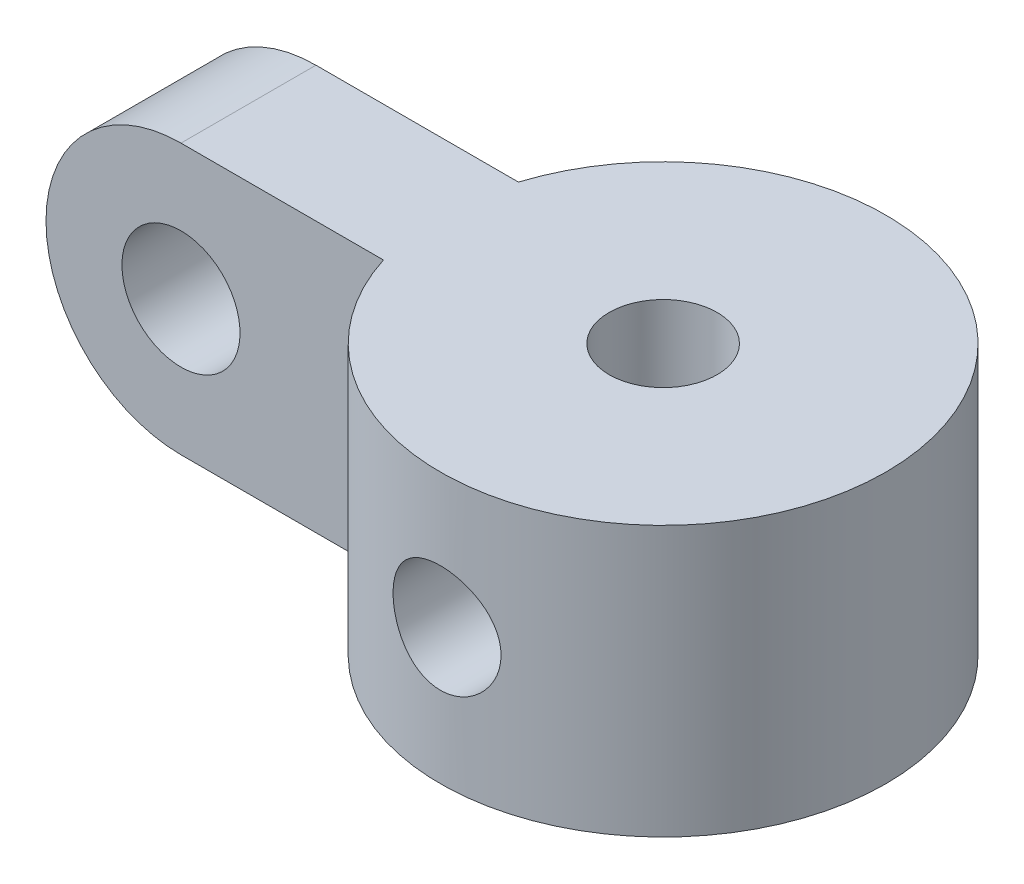
ISO-10303-21;
HEADER;
FILE_DESCRIPTION(('STEP AP214'),'2;1');
FILE_NAME('part.step','',(''),(''),'','','');
FILE_SCHEMA(('AUTOMOTIVE_DESIGN { 1 0 10303 214 1 1 1 1 }'));
ENDSEC;
DATA;
#1=APPLICATION_CONTEXT('core data for automotive mechanical design processes');
#2=APPLICATION_PROTOCOL_DEFINITION('international standard','automotive_design',2000,#1);
#3=PRODUCT_CONTEXT('',#1,'mechanical');
#4=PRODUCT('Part','Part','',(#3));
#5=PRODUCT_RELATED_PRODUCT_CATEGORY('part','',(#4));
#6=PRODUCT_DEFINITION_FORMATION('','',#4);
#7=PRODUCT_DEFINITION_CONTEXT('part definition',#1,'design');
#8=PRODUCT_DEFINITION('design','',#6,#7);
#9=PRODUCT_DEFINITION_SHAPE('','',#8);
#10=(LENGTH_UNIT() NAMED_UNIT(*) SI_UNIT(.MILLI.,.METRE.));
#11=(NAMED_UNIT(*) PLANE_ANGLE_UNIT() SI_UNIT($,.RADIAN.));
#12=(NAMED_UNIT(*) SI_UNIT($,.STERADIAN.) SOLID_ANGLE_UNIT());
#13=UNCERTAINTY_MEASURE_WITH_UNIT(LENGTH_MEASURE(1.E-05),#10,'distance_accuracy_value','');
#14=(GEOMETRIC_REPRESENTATION_CONTEXT(3) GLOBAL_UNCERTAINTY_ASSIGNED_CONTEXT((#13)) GLOBAL_UNIT_ASSIGNED_CONTEXT((#10,
#11,#12)) REPRESENTATION_CONTEXT('',''));
#15=CARTESIAN_POINT('',(0.,0.,0.));
#16=DIRECTION('',(0.,0.,1.));
#17=DIRECTION('',(1.,0.,0.));
#18=AXIS2_PLACEMENT_3D('',#15,#16,#17);
#19=CARTESIAN_POINT('',(0.,8.,-2.));
#20=DIRECTION('',(0.,0.,-1.));
#21=DIRECTION('',(-1.,0.,0.));
#22=AXIS2_PLACEMENT_3D('',#19,#20,#21);
#23=PLANE('',#22);
#24=CARTESIAN_POINT('',(-12.2896740774066,4.,-2.));
#25=DIRECTION('',(0.,0.,-1.));
#26=DIRECTION('',(-1.,0.,0.));
#27=AXIS2_PLACEMENT_3D('',#24,#25,#26);
#28=CIRCLE('',#27,1.75);
#29=CARTESIAN_POINT('',(-14.0396740774066,4.,-2.));
#30=VERTEX_POINT('',#29);
#31=EDGE_CURVE('E221',#30,#30,#28,.T.);
#32=ORIENTED_EDGE('',*,*,#31,.F.);
#33=EDGE_LOOP('',(#32));
#34=FACE_BOUND('',#33,.T.);
#35=DIRECTION('',(1.,0.,0.));
#36=VECTOR('',#35,1.);
#37=CARTESIAN_POINT('',(0.,0.,-2.));
#38=LINE('',#37,#36);
#39=CARTESIAN_POINT('',(-12.2896740774066,0.,-2.));
#40=VERTEX_POINT('',#39);
#41=CARTESIAN_POINT('',(-6.28967407740656,0.,-2.));
#42=VERTEX_POINT('',#41);
#43=EDGE_CURVE('E156',#40,#42,#38,.T.);
#44=ORIENTED_EDGE('',*,*,#43,.F.);
#45=CARTESIAN_POINT('',(-12.2896740774066,4.,-2.));
#46=DIRECTION('',(0.,0.,-1.));
#47=DIRECTION('',(-1.,0.,0.));
#48=AXIS2_PLACEMENT_3D('',#45,#46,#47);
#49=CIRCLE('',#48,4.);
#50=CARTESIAN_POINT('',(-12.2896740774066,8.,-2.));
#51=VERTEX_POINT('',#50);
#52=EDGE_CURVE('E141',#40,#51,#49,.T.);
#53=ORIENTED_EDGE('',*,*,#52,.T.);
#54=DIRECTION('',(1.,0.,0.));
#55=VECTOR('',#54,1.);
#56=CARTESIAN_POINT('',(0.,8.,-2.));
#57=LINE('',#56,#55);
#58=CARTESIAN_POINT('',(-6.28967407740656,8.,-2.));
#59=VERTEX_POINT('',#58);
#60=EDGE_CURVE('E209',#51,#59,#57,.T.);
#61=ORIENTED_EDGE('',*,*,#60,.T.);
#62=DIRECTION('',(0.,-1.,0.));
#63=VECTOR('',#62,1.);
#64=CARTESIAN_POINT('',(-6.28967407740656,8.,-2.));
#65=LINE('',#64,#63);
#66=EDGE_CURVE('E162',#59,#42,#65,.T.);
#67=ORIENTED_EDGE('',*,*,#66,.T.);
#68=EDGE_LOOP('',(#44,#53,#61,#67));
#69=FACE_BOUND('',#68,.T.);
#70=ADVANCED_FACE('F93',(#34,#69),#23,.T.);
#71=CARTESIAN_POINT('',(0.,8.,2.));
#72=DIRECTION('',(0.,0.,-1.));
#73=DIRECTION('',(-1.,0.,0.));
#74=AXIS2_PLACEMENT_3D('',#71,#72,#73);
#75=PLANE('',#74);
#76=CARTESIAN_POINT('',(-12.2896740774066,4.,2.));
#77=DIRECTION('',(0.,0.,-1.));
#78=DIRECTION('',(-1.,0.,0.));
#79=AXIS2_PLACEMENT_3D('',#76,#77,#78);
#80=CIRCLE('',#79,1.75);
#81=CARTESIAN_POINT('',(-14.0396740774066,4.,2.));
#82=VERTEX_POINT('',#81);
#83=EDGE_CURVE('E97',#82,#82,#80,.T.);
#84=ORIENTED_EDGE('',*,*,#83,.T.);
#85=EDGE_LOOP('',(#84));
#86=FACE_BOUND('',#85,.T.);
#87=CARTESIAN_POINT('',(-12.2896740774066,4.,2.));
#88=DIRECTION('',(0.,0.,-1.));
#89=DIRECTION('',(-1.,0.,0.));
#90=AXIS2_PLACEMENT_3D('',#87,#88,#89);
#91=CIRCLE('',#90,4.);
#92=CARTESIAN_POINT('',(-12.2896740774066,0.,2.));
#93=VERTEX_POINT('',#92);
#94=CARTESIAN_POINT('',(-12.2896740774066,8.,2.));
#95=VERTEX_POINT('',#94);
#96=EDGE_CURVE('E117',#93,#95,#91,.T.);
#97=ORIENTED_EDGE('',*,*,#96,.F.);
#98=DIRECTION('',(1.,0.,0.));
#99=VECTOR('',#98,1.);
#100=CARTESIAN_POINT('',(0.,0.,2.));
#101=LINE('',#100,#99);
#102=CARTESIAN_POINT('',(-6.28967407740656,0.,2.));
#103=VERTEX_POINT('',#102);
#104=EDGE_CURVE('E158',#93,#103,#101,.T.);
#105=ORIENTED_EDGE('',*,*,#104,.T.);
#106=DIRECTION('',(0.,-1.,0.));
#107=VECTOR('',#106,1.);
#108=CARTESIAN_POINT('',(-6.28967407740656,8.,2.));
#109=LINE('',#108,#107);
#110=CARTESIAN_POINT('',(-6.28967407740656,8.,2.));
#111=VERTEX_POINT('',#110);
#112=EDGE_CURVE('E174',#111,#103,#109,.T.);
#113=ORIENTED_EDGE('',*,*,#112,.F.);
#114=DIRECTION('',(1.,0.,0.));
#115=VECTOR('',#114,1.);
#116=CARTESIAN_POINT('',(0.,8.,2.));
#117=LINE('',#116,#115);
#118=EDGE_CURVE('E178',#95,#111,#117,.T.);
#119=ORIENTED_EDGE('',*,*,#118,.F.);
#120=EDGE_LOOP('',(#97,#105,#113,#119));
#121=FACE_BOUND('',#120,.T.);
#122=ADVANCED_FACE('F253',(#86,#121),#75,.F.);
#123=CARTESIAN_POINT('',(0.,8.,0.));
#124=DIRECTION('',(0.,-1.,0.));
#125=DIRECTION('',(0.,0.,-1.));
#126=AXIS2_PLACEMENT_3D('',#123,#124,#125);
#127=CYLINDRICAL_SURFACE('',#126,1.6);
#128=CARTESIAN_POINT('',(0.,4.,0.));
#129=DIRECTION('',(0.,-0.707106781186547,0.707106781186547));
#130=DIRECTION('',(0.,-0.707106781186547,-0.707106781186547));
#131=AXIS2_PLACEMENT_3D('',#128,#129,#130);
#132=ELLIPSE('',#131,2.26274169979695,1.6);
#133=CARTESIAN_POINT('',(-1.6,4.,0.));
#134=VERTEX_POINT('',#133);
#135=CARTESIAN_POINT('',(1.6,4.,0.));
#136=VERTEX_POINT('',#135);
#137=EDGE_CURVE('E12',#134,#136,#132,.F.);
#138=ORIENTED_EDGE('',*,*,#137,.F.);
#139=CARTESIAN_POINT('',(0.,4.,0.));
#140=DIRECTION('',(0.,-0.707106781186547,-0.707106781186547));
#141=DIRECTION('',(0.,-0.707106781186547,0.707106781186547));
#142=AXIS2_PLACEMENT_3D('',#139,#140,#141);
#143=ELLIPSE('',#142,2.26274169979695,1.6);
#144=EDGE_CURVE('E109',#136,#134,#143,.F.);
#145=ORIENTED_EDGE('',*,*,#144,.F.);
#146=EDGE_LOOP('',(#138,#145));
#147=FACE_BOUND('',#146,.T.);
#148=CARTESIAN_POINT('',(0.,8.,0.));
#149=DIRECTION('',(0.,1.,0.));
#150=DIRECTION('',(0.,0.,1.));
#151=AXIS2_PLACEMENT_3D('',#148,#149,#150);
#152=CIRCLE('',#151,1.6);
#153=CARTESIAN_POINT('',(0.,8.,1.6));
#154=VERTEX_POINT('',#153);
#155=EDGE_CURVE('E169',#154,#154,#152,.T.);
#156=ORIENTED_EDGE('',*,*,#155,.T.);
#157=EDGE_LOOP('',(#156));
#158=FACE_BOUND('',#157,.T.);
#159=ADVANCED_FACE('F201',(#147,#158),#127,.F.);
#160=CARTESIAN_POINT('',(0.,0.,0.));
#161=DIRECTION('',(0.,1.,0.));
#162=DIRECTION('',(0.,0.,1.));
#163=AXIS2_PLACEMENT_3D('',#160,#161,#162);
#164=PLANE('',#163);
#165=CARTESIAN_POINT('',(0.,0.,0.));
#166=DIRECTION('',(0.,1.,0.));
#167=DIRECTION('',(0.,0.,1.));
#168=AXIS2_PLACEMENT_3D('',#165,#166,#167);
#169=CIRCLE('',#168,1.6);
#170=CARTESIAN_POINT('',(0.,0.,1.6));
#171=VERTEX_POINT('',#170);
#172=EDGE_CURVE('E151',#171,#171,#169,.T.);
#173=ORIENTED_EDGE('',*,*,#172,.T.);
#174=EDGE_LOOP('',(#173));
#175=FACE_BOUND('',#174,.T.);
#176=DIRECTION('',(0.,0.,1.));
#177=VECTOR('',#176,1.);
#178=CARTESIAN_POINT('',(-12.2896740774066,0.,-6.6));
#179=LINE('',#178,#177);
#180=EDGE_CURVE('E144',#40,#93,#179,.T.);
#181=ORIENTED_EDGE('',*,*,#180,.F.);
#182=ORIENTED_EDGE('',*,*,#43,.T.);
#183=CARTESIAN_POINT('',(0.,0.,0.));
#184=DIRECTION('',(0.,1.,0.));
#185=DIRECTION('',(0.,0.,1.));
#186=AXIS2_PLACEMENT_3D('',#183,#184,#185);
#187=CIRCLE('',#186,6.6);
#188=EDGE_CURVE('E165',#103,#42,#187,.T.);
#189=ORIENTED_EDGE('',*,*,#188,.F.);
#190=ORIENTED_EDGE('',*,*,#104,.F.);
#191=EDGE_LOOP('',(#181,#182,#189,#190));
#192=FACE_BOUND('',#191,.T.);
#193=ADVANCED_FACE('F154',(#175,#192),#164,.F.);
#194=CARTESIAN_POINT('',(0.,8.,0.));
#195=DIRECTION('',(0.,1.,0.));
#196=DIRECTION('',(0.,0.,1.));
#197=AXIS2_PLACEMENT_3D('',#194,#195,#196);
#198=PLANE('',#197);
#199=ORIENTED_EDGE('',*,*,#155,.F.);
#200=EDGE_LOOP('',(#199));
#201=FACE_BOUND('',#200,.T.);
#202=ORIENTED_EDGE('',*,*,#60,.F.);
#203=DIRECTION('',(0.,0.,1.));
#204=VECTOR('',#203,1.);
#205=CARTESIAN_POINT('',(-12.2896740774066,8.,-6.6));
#206=LINE('',#205,#204);
#207=EDGE_CURVE('E146',#51,#95,#206,.T.);
#208=ORIENTED_EDGE('',*,*,#207,.T.);
#209=ORIENTED_EDGE('',*,*,#118,.T.);
#210=CARTESIAN_POINT('',(0.,8.,0.));
#211=DIRECTION('',(0.,1.,0.));
#212=DIRECTION('',(0.,0.,1.));
#213=AXIS2_PLACEMENT_3D('',#210,#211,#212);
#214=CIRCLE('',#213,6.6);
#215=EDGE_CURVE('E212',#111,#59,#214,.T.);
#216=ORIENTED_EDGE('',*,*,#215,.T.);
#217=EDGE_LOOP('',(#202,#208,#209,#216));
#218=FACE_BOUND('',#217,.T.);
#219=ADVANCED_FACE('F247',(#201,#218),#198,.T.);
#220=CARTESIAN_POINT('',(0.,8.,0.));
#221=DIRECTION('',(0.,-1.,0.));
#222=DIRECTION('',(0.,0.,-1.));
#223=AXIS2_PLACEMENT_3D('',#220,#221,#222);
#224=CYLINDRICAL_SURFACE('',#223,6.6);
#225=CARTESIAN_POINT('',(1.6,4.,-6.40312423743285));
#226=CARTESIAN_POINT('',(1.59999733947836,4.08844402406098,-6.40312597037609));
#227=CARTESIAN_POINT('',(1.59264157848281,4.17691809600071,-6.40497670400888));
#228=CARTESIAN_POINT('',(1.56345601743318,4.35133182154082,-6.4121621325328));
#229=CARTESIAN_POINT('',(1.54161728105349,4.43726987614424,-6.41749897840401));
#230=CARTESIAN_POINT('',(1.48420900234039,4.60406355514517,-6.43101748536075));
#231=CARTESIAN_POINT('',(1.44865650524925,4.68492534448298,-6.43919561368331));
#232=CARTESIAN_POINT('',(1.3648810998873,4.83954379086885,-6.45747086045777));
#233=CARTESIAN_POINT('',(1.31665785249965,4.91330025767959,-6.46756803026843));
#234=CARTESIAN_POINT('',(1.20784389900135,5.05314159602282,-6.48877758318028));
#235=CARTESIAN_POINT('',(1.14703929913897,5.11905772455782,-6.49990538881894));
#236=CARTESIAN_POINT('',(1.01524965153105,5.23986289597431,-6.5217882988137));
#237=CARTESIAN_POINT('',(0.944263695721746,5.29475095422509,-6.53254336981968));
#238=CARTESIAN_POINT('',(0.792976530006599,5.39262652396975,-6.55263898037571));
#239=CARTESIAN_POINT('',(0.71256570600993,5.43544913714583,-6.56195919706409));
#240=CARTESIAN_POINT('',(0.545423893058168,5.50690743021361,-6.57795945463852));
#241=CARTESIAN_POINT('',(0.458693781262912,5.53554507478769,-6.58463986112431));
#242=CARTESIAN_POINT('',(0.28313343703087,5.57728248350463,-6.59449878121048));
#243=CARTESIAN_POINT('',(0.194374956348101,5.59066857236418,-6.59774174354862));
#244=CARTESIAN_POINT('',(0.0158168750524344,5.60242074593819,-6.60058464260182));
#245=CARTESIAN_POINT('',(-0.0739825787233714,5.60078892390197,-6.60018508702391));
#246=CARTESIAN_POINT('',(-0.25009076322241,5.5827593886002,-6.59583627033507));
#247=CARTESIAN_POINT('',(-0.336433231377963,5.56667061845232,-6.59196128200833));
#248=CARTESIAN_POINT('',(-0.505154519829912,5.52067938716169,-6.58118299179282));
#249=CARTESIAN_POINT('',(-0.587533136198652,5.49077621614884,-6.57427953428333));
#250=CARTESIAN_POINT('',(-0.74681326529544,5.41774922909505,-6.55810487467464));
#251=CARTESIAN_POINT('',(-0.823661440791099,5.37451366657421,-6.54881377443151));
#252=CARTESIAN_POINT('',(-0.969121094903154,5.27613357148008,-6.52887450690487));
#253=CARTESIAN_POINT('',(-1.03773121476807,5.22098707855287,-6.51822611635086));
#254=CARTESIAN_POINT('',(-1.16660863727456,5.09868762962085,-6.49641521034034));
#255=CARTESIAN_POINT('',(-1.22661882104947,5.03126455163238,-6.48524650824044));
#256=CARTESIAN_POINT('',(-1.33453585965573,4.88719490884861,-6.46390352969242));
#257=CARTESIAN_POINT('',(-1.38244221584308,4.81054796424765,-6.45372929422414));
#258=CARTESIAN_POINT('',(-1.46494322915083,4.64972470273884,-6.43550637883586));
#259=CARTESIAN_POINT('',(-1.4994794029305,4.56551724795948,-6.42746708453676));
#260=CARTESIAN_POINT('',(-1.55382718977604,4.39225039215391,-6.41454673226991));
#261=CARTESIAN_POINT('',(-1.57364174189015,4.30319196339657,-6.40966504393782));
#262=CARTESIAN_POINT('',(-1.59756435294379,4.12512682937485,-6.40374402358904));
#263=CARTESIAN_POINT('',(-1.60205110778769,4.03617402039503,-6.40261207062851));
#264=CARTESIAN_POINT('',(-1.59622462099622,3.85879092404816,-6.40406713975094));
#265=CARTESIAN_POINT('',(-1.58591265192973,3.77036059240892,-6.4066538420601));
#266=CARTESIAN_POINT('',(-1.55111264233716,3.59791634012609,-6.41516633208495));
#267=CARTESIAN_POINT('',(-1.52684202876438,3.51385577255964,-6.42104086992378));
#268=CARTESIAN_POINT('',(-1.46505330245464,3.35099563472862,-6.43541907577093));
#269=CARTESIAN_POINT('',(-1.427533693674,3.27219665978537,-6.44392304067414));
#270=CARTESIAN_POINT('',(-1.33950890361332,3.12048324751841,-6.46279907110407));
#271=CARTESIAN_POINT('',(-1.28877556385843,3.04770522515797,-6.47320288866304));
#272=CARTESIAN_POINT('',(-1.176054449739,2.91155642689974,-6.49462703788132));
#273=CARTESIAN_POINT('',(-1.11406494115952,2.84818710331931,-6.50564746435902));
#274=CARTESIAN_POINT('',(-0.978859243852804,2.73113684816081,-6.52737484171816));
#275=CARTESIAN_POINT('',(-0.905414542587484,2.67771694544761,-6.5380684476914));
#276=CARTESIAN_POINT('',(-0.750376177663217,2.58397023624514,-6.55766967940658));
#277=CARTESIAN_POINT('',(-0.668782931491631,2.54364275942034,-6.56657739657757));
#278=CARTESIAN_POINT('',(-0.500317828978865,2.47756489223356,-6.58154809251216));
#279=CARTESIAN_POINT('',(-0.413487967421985,2.45171216041208,-6.58763099011155));
#280=CARTESIAN_POINT('',(-0.236550277056997,2.41500676666825,-6.59635362322054));
#281=CARTESIAN_POINT('',(-0.146443043735652,2.40415139361489,-6.5989939810466));
#282=CARTESIAN_POINT('',(0.0320330834287471,2.39789370197624,-6.60051038370048));
#283=CARTESIAN_POINT('',(0.120387845166776,2.4021050810357,-6.59948053308083));
#284=CARTESIAN_POINT('',(0.295090603727327,2.42498180031035,-6.59397912156365));
#285=CARTESIAN_POINT('',(0.381438653778092,2.44364675669111,-6.58950765206303));
#286=CARTESIAN_POINT('',(0.549299070646439,2.49469887896567,-6.57763810488231));
#287=CARTESIAN_POINT('',(0.630832598167391,2.52701996018495,-6.57025413266408));
#288=CARTESIAN_POINT('',(0.787364816025318,2.60440616156891,-6.55333973860274));
#289=CARTESIAN_POINT('',(0.862362725594601,2.64947280163974,-6.54380906079289));
#290=CARTESIAN_POINT('',(1.00554031833552,2.75226967813651,-6.52336129617945));
#291=CARTESIAN_POINT('',(1.07352623332947,2.81026451788978,-6.51241761643753));
#292=CARTESIAN_POINT('',(1.19893242972994,2.93675265363601,-6.49050250288316));
#293=CARTESIAN_POINT('',(1.25635006733463,3.00524856878544,-6.47953106282008));
#294=CARTESIAN_POINT('',(1.35995880768537,3.15221778456658,-6.45858815699281));
#295=CARTESIAN_POINT('',(1.40593901379458,3.23084290180638,-6.448637221504));
#296=CARTESIAN_POINT('',(1.48395977964431,3.39493550764195,-6.43113315660768));
#297=CARTESIAN_POINT('',(1.51601091235572,3.48039774791219,-6.42357820968792));
#298=CARTESIAN_POINT('',(1.56024691692113,3.63814570603387,-6.41295817096726));
#299=CARTESIAN_POINT('',(1.57512286070378,3.70964864102359,-6.40929733413103));
#300=CARTESIAN_POINT('',(1.59500013121856,3.85409430607224,-6.40437974225737));
#301=CARTESIAN_POINT('',(1.60000219483265,3.92703692827776,-6.40312280781832));
#302=CARTESIAN_POINT('',(1.6,4.,-6.40312423743285));
#303=B_SPLINE_CURVE_WITH_KNOTS('',3,(#225,#226,#227,#228,#229,#230,#231,#232,#233,#234,#235,
#236,#237,#238,#239,#240,#241,#242,#243,#244,#245,#246,#247,#248,#249,#250,#251,#252,#253,#254,
#255,#256,#257,#258,#259,#260,#261,#262,#263,#264,#265,#266,#267,#268,#269,#270,#271,#272,#273,
#274,#275,#276,#277,#278,#279,#280,#281,#282,#283,#284,#285,#286,#287,#288,#289,#290,#291,#292,
#293,#294,#295,#296,#297,#298,#299,#300,#301,#302),.UNSPECIFIED.,.T.,.F.,(4,2,2,2,2,2,2,2,2,2,2,
2,2,2,2,2,2,2,2,2,2,2,2,2,2,2,2,2,2,2,2,2,2,2,2,2,2,2,4),(0.,0.265064273258436,
0.530292249566571,0.795191622869191,1.0600980865956,1.32994540119492,1.59981679815771,
1.87321504847942,2.14657542130955,2.41471463941518,2.68281648389817,2.94532180998148,
3.20784062672676,3.47262248908861,3.73744796368044,4.00902119378664,4.28060561013037,
4.55336490852977,4.82606973818098,5.09198626575298,5.35787992805489,5.619739930883,
5.88162951175322,6.1483813618781,6.41517434484027,6.68820231251325,6.96121629887957,
7.23227478485269,7.50328426411234,7.76739558504667,8.03149989238554,8.29434052625653,
8.55721251706291,8.82606066778539,9.09497598347789,9.36853321512672,9.64188243681685,
9.86056704862862,10.0792353395176),.UNSPECIFIED.);
#304=CARTESIAN_POINT('',(1.6,4.,-6.40312423743285));
#305=VERTEX_POINT('',#304);
#306=EDGE_CURVE('E225',#305,#305,#303,.T.);
#307=ORIENTED_EDGE('',*,*,#306,.T.);
#308=EDGE_LOOP('',(#307));
#309=FACE_BOUND('',#308,.T.);
#310=CARTESIAN_POINT('',(1.6,4.,6.40312423743285));
#311=CARTESIAN_POINT('',(1.59999733947836,3.91155597593902,6.40312597037609));
#312=CARTESIAN_POINT('',(1.59264157848281,3.82308190399929,6.40497670400888));
#313=CARTESIAN_POINT('',(1.56345601743318,3.64866817845918,6.4121621325328));
#314=CARTESIAN_POINT('',(1.54161728105349,3.56273012385576,6.41749897840401));
#315=CARTESIAN_POINT('',(1.48420900234039,3.39593644485483,6.43101748536075));
#316=CARTESIAN_POINT('',(1.44865650524925,3.31507465551702,6.43919561368331));
#317=CARTESIAN_POINT('',(1.3648810998873,3.16045620913115,6.45747086045777));
#318=CARTESIAN_POINT('',(1.31665785249964,3.08669974232041,6.46756803026843));
#319=CARTESIAN_POINT('',(1.20784389900135,2.94685840397718,6.48877758318028));
#320=CARTESIAN_POINT('',(1.14703929913897,2.88094227544218,6.49990538881894));
#321=CARTESIAN_POINT('',(1.01524965153105,2.76013710402569,6.5217882988137));
#322=CARTESIAN_POINT('',(0.944263695721746,2.70524904577491,6.53254336981968));
#323=CARTESIAN_POINT('',(0.792976530006598,2.60737347603025,6.55263898037571));
#324=CARTESIAN_POINT('',(0.712565706009929,2.56455086285417,6.56195919706409));
#325=CARTESIAN_POINT('',(0.545423893058167,2.49309256978639,6.57795945463852));
#326=CARTESIAN_POINT('',(0.458693781262911,2.46445492521231,6.58463986112431));
#327=CARTESIAN_POINT('',(0.283133437030869,2.42271751649537,6.59449878121048));
#328=CARTESIAN_POINT('',(0.1943749563481,2.40933142763582,6.59774174354862));
#329=CARTESIAN_POINT('',(0.015816875052433,2.39757925406181,6.60058464260182));
#330=CARTESIAN_POINT('',(-0.0739825787233729,2.39921107609803,6.60018508702391));
#331=CARTESIAN_POINT('',(-0.250090763222411,2.4172406113998,6.59583627033507));
#332=CARTESIAN_POINT('',(-0.336433231377964,2.43332938154768,6.59196128200833));
#333=CARTESIAN_POINT('',(-0.505154519829913,2.47932061283831,6.58118299179282));
#334=CARTESIAN_POINT('',(-0.587533136198653,2.50922378385116,6.57427953428333));
#335=CARTESIAN_POINT('',(-0.746813265295442,2.58225077090495,6.55810487467464));
#336=CARTESIAN_POINT('',(-0.823661440791101,2.62548633342579,6.54881377443151));
#337=CARTESIAN_POINT('',(-0.969121094903155,2.72386642851992,6.52887450690487));
#338=CARTESIAN_POINT('',(-1.03773121476807,2.77901292144713,6.51822611635086));
#339=CARTESIAN_POINT('',(-1.16660863727457,2.90131237037916,6.49641521034034));
#340=CARTESIAN_POINT('',(-1.22661882104947,2.96873544836762,6.48524650824044));
#341=CARTESIAN_POINT('',(-1.33453585965573,3.11280509115139,6.46390352969242));
#342=CARTESIAN_POINT('',(-1.38244221584308,3.18945203575236,6.45372929422414));
#343=CARTESIAN_POINT('',(-1.46494322915083,3.35027529726117,6.43550637883586));
#344=CARTESIAN_POINT('',(-1.4994794029305,3.43448275204052,6.42746708453676));
#345=CARTESIAN_POINT('',(-1.55382718977604,3.60774960784609,6.41454673226991));
#346=CARTESIAN_POINT('',(-1.57364174189015,3.69680803660343,6.40966504393782));
#347=CARTESIAN_POINT('',(-1.59756435294379,3.87487317062515,6.40374402358904));
#348=CARTESIAN_POINT('',(-1.60205110778769,3.96382597960497,6.40261207062851));
#349=CARTESIAN_POINT('',(-1.59622462099622,4.14120907595185,6.40406713975094));
#350=CARTESIAN_POINT('',(-1.58591265192973,4.22963940759109,6.4066538420601));
#351=CARTESIAN_POINT('',(-1.55111264233716,4.40208365987391,6.41516633208495));
#352=CARTESIAN_POINT('',(-1.52684202876438,4.48614422744036,6.42104086992378));
#353=CARTESIAN_POINT('',(-1.46505330245464,4.64900436527138,6.43541907577093));
#354=CARTESIAN_POINT('',(-1.427533693674,4.72780334021463,6.44392304067414));
#355=CARTESIAN_POINT('',(-1.33950890361332,4.87951675248159,6.46279907110407));
#356=CARTESIAN_POINT('',(-1.28877556385843,4.95229477484203,6.47320288866304));
#357=CARTESIAN_POINT('',(-1.176054449739,5.08844357310027,6.49462703788132));
#358=CARTESIAN_POINT('',(-1.11406494115952,5.15181289668069,6.50564746435903));
#359=CARTESIAN_POINT('',(-0.978859243852802,5.2688631518392,6.52737484171817));
#360=CARTESIAN_POINT('',(-0.905414542587482,5.3222830545524,6.5380684476914));
#361=CARTESIAN_POINT('',(-0.750376177663215,5.41602976375486,6.55766967940658));
#362=CARTESIAN_POINT('',(-0.668782931491629,5.45635724057966,6.56657739657757));
#363=CARTESIAN_POINT('',(-0.500317828978863,5.52243510776645,6.58154809251216));
#364=CARTESIAN_POINT('',(-0.413487967421983,5.54828783958792,6.58763099011155));
#365=CARTESIAN_POINT('',(-0.236550277056996,5.58499323333175,6.59635362322054));
#366=CARTESIAN_POINT('',(-0.14644304373565,5.59584860638511,6.5989939810466));
#367=CARTESIAN_POINT('',(0.0320330834287485,5.60210629802376,6.60051038370048));
#368=CARTESIAN_POINT('',(0.120387845166777,5.5978949189643,6.59948053308083));
#369=CARTESIAN_POINT('',(0.295090603727328,5.57501819968965,6.59397912156365));
#370=CARTESIAN_POINT('',(0.381438653778093,5.55635324330889,6.58950765206303));
#371=CARTESIAN_POINT('',(0.549299070646441,5.50530112103433,6.57763810488231));
#372=CARTESIAN_POINT('',(0.630832598167394,5.47298003981505,6.57025413266408));
#373=CARTESIAN_POINT('',(0.787364816025321,5.39559383843109,6.55333973860274));
#374=CARTESIAN_POINT('',(0.862362725594603,5.35052719836026,6.54380906079289));
#375=CARTESIAN_POINT('',(1.00554031833552,5.24773032186349,6.52336129617945));
#376=CARTESIAN_POINT('',(1.07352623332948,5.18973548211022,6.51241761643753));
#377=CARTESIAN_POINT('',(1.19893242972994,5.06324734636399,6.49050250288316));
#378=CARTESIAN_POINT('',(1.25635006733463,4.99475143121456,6.47953106282008));
#379=CARTESIAN_POINT('',(1.35995880768537,4.84778221543341,6.45858815699281));
#380=CARTESIAN_POINT('',(1.40593901379458,4.76915709819362,6.448637221504));
#381=CARTESIAN_POINT('',(1.48395977964431,4.60506449235805,6.43113315660768));
#382=CARTESIAN_POINT('',(1.51601091235572,4.51960225208781,6.42357820968792));
#383=CARTESIAN_POINT('',(1.56024691692113,4.36185429396613,6.41295817096726));
#384=CARTESIAN_POINT('',(1.57512286070378,4.29035135897641,6.40929733413103));
#385=CARTESIAN_POINT('',(1.59500013121856,4.14590569392776,6.40437974225737));
#386=CARTESIAN_POINT('',(1.60000219483265,4.07296307172224,6.40312280781832));
#387=CARTESIAN_POINT('',(1.6,4.,6.40312423743285));
#388=B_SPLINE_CURVE_WITH_KNOTS('',3,(#310,#311,#312,#313,#314,#315,#316,#317,#318,#319,#320,
#321,#322,#323,#324,#325,#326,#327,#328,#329,#330,#331,#332,#333,#334,#335,#336,#337,#338,#339,
#340,#341,#342,#343,#344,#345,#346,#347,#348,#349,#350,#351,#352,#353,#354,#355,#356,#357,#358,
#359,#360,#361,#362,#363,#364,#365,#366,#367,#368,#369,#370,#371,#372,#373,#374,#375,#376,#377,
#378,#379,#380,#381,#382,#383,#384,#385,#386,#387),.UNSPECIFIED.,.T.,.F.,(4,2,2,2,2,2,2,2,2,2,2,
2,2,2,2,2,2,2,2,2,2,2,2,2,2,2,2,2,2,2,2,2,2,2,2,2,2,2,4),(0.,0.265064273258436,
0.530292249566571,0.795191622869193,1.0600980865956,1.32994540119492,1.59981679815771,
1.87321504847942,2.14657542130956,2.41471463941518,2.68281648389817,2.94532180998148,
3.20784062672676,3.47262248908861,3.73744796368044,4.00902119378665,4.28060561013037,
4.55336490852977,4.82606973818099,5.09198626575298,5.3578799280549,5.619739930883,
5.88162951175322,6.1483813618781,6.41517434484028,6.68820231251325,6.96121629887958,
7.23227478485269,7.50328426411234,7.76739558504667,8.03149989238554,8.29434052625654,
8.55721251706292,8.82606066778539,9.09497598347789,9.36853321512673,9.64188243681686,
9.86056704862863,10.0792353395176),.UNSPECIFIED.);
#389=CARTESIAN_POINT('',(1.6,4.,6.40312423743285));
#390=VERTEX_POINT('',#389);
#391=EDGE_CURVE('E233',#390,#390,#388,.T.);
#392=ORIENTED_EDGE('',*,*,#391,.T.);
#393=EDGE_LOOP('',(#392));
#394=FACE_BOUND('',#393,.T.);
#395=ORIENTED_EDGE('',*,*,#188,.T.);
#396=ORIENTED_EDGE('',*,*,#66,.F.);
#397=ORIENTED_EDGE('',*,*,#215,.F.);
#398=ORIENTED_EDGE('',*,*,#112,.T.);
#399=EDGE_LOOP('',(#395,#396,#397,#398));
#400=FACE_BOUND('',#399,.T.);
#401=ADVANCED_FACE('F200',(#309,#394,#400),#224,.T.);
#402=CARTESIAN_POINT('',(0.,4.,0.));
#403=DIRECTION('',(0.,-0.707106781186547,0.707106781186547));
#404=DIRECTION('',(0.,-0.707106781186547,-0.707106781186547));
#405=AXIS2_PLACEMENT_3D('',#402,#403,#404);
#406=ELLIPSE('',#405,2.26274169979695,1.6);
#407=EDGE_CURVE('E103',#134,#136,#406,.T.);
#408=ORIENTED_EDGE('',*,*,#407,.F.);
#409=CARTESIAN_POINT('',(0.,4.,0.));
#410=DIRECTION('',(0.,-0.707106781186547,-0.707106781186547));
#411=DIRECTION('',(0.,-0.707106781186547,0.707106781186547));
#412=AXIS2_PLACEMENT_3D('',#409,#410,#411);
#413=ELLIPSE('',#412,2.26274169979695,1.6);
#414=EDGE_CURVE('E185',#136,#134,#413,.T.);
#415=ORIENTED_EDGE('',*,*,#414,.F.);
#416=EDGE_LOOP('',(#408,#415));
#417=FACE_BOUND('',#416,.T.);
#418=ORIENTED_EDGE('',*,*,#172,.F.);
#419=EDGE_LOOP('',(#418));
#420=FACE_BOUND('',#419,.T.);
#421=ADVANCED_FACE('F95',(#417,#420),#127,.F.);
#422=CARTESIAN_POINT('',(-12.2896740774066,4.,-6.6));
#423=DIRECTION('',(0.,0.,1.));
#424=DIRECTION('',(1.,0.,0.));
#425=AXIS2_PLACEMENT_3D('',#422,#423,#424);
#426=CYLINDRICAL_SURFACE('',#425,4.);
#427=ORIENTED_EDGE('',*,*,#52,.F.);
#428=ORIENTED_EDGE('',*,*,#180,.T.);
#429=ORIENTED_EDGE('',*,*,#96,.T.);
#430=ORIENTED_EDGE('',*,*,#207,.F.);
#431=EDGE_LOOP('',(#427,#428,#429,#430));
#432=FACE_BOUND('',#431,.T.);
#433=ADVANCED_FACE('F143',(#432),#426,.T.);
#434=CARTESIAN_POINT('',(0.,4.,-6.6));
#435=DIRECTION('',(0.,0.,1.));
#436=DIRECTION('',(1.,0.,0.));
#437=AXIS2_PLACEMENT_3D('',#434,#435,#436);
#438=CYLINDRICAL_SURFACE('',#437,1.6);
#439=ORIENTED_EDGE('',*,*,#407,.T.);
#440=ORIENTED_EDGE('',*,*,#144,.T.);
#441=EDGE_LOOP('',(#439,#440));
#442=FACE_BOUND('',#441,.T.);
#443=ORIENTED_EDGE('',*,*,#306,.F.);
#444=EDGE_LOOP('',(#443));
#445=FACE_BOUND('',#444,.T.);
#446=ADVANCED_FACE('F191',(#442,#445),#438,.F.);
#447=ORIENTED_EDGE('',*,*,#137,.T.);
#448=ORIENTED_EDGE('',*,*,#414,.T.);
#449=EDGE_LOOP('',(#447,#448));
#450=FACE_BOUND('',#449,.T.);
#451=ORIENTED_EDGE('',*,*,#391,.F.);
#452=EDGE_LOOP('',(#451));
#453=FACE_BOUND('',#452,.T.);
#454=ADVANCED_FACE('F196',(#450,#453),#438,.F.);
#455=CARTESIAN_POINT('',(-12.2896740774066,4.,-6.6));
#456=DIRECTION('',(0.,0.,1.));
#457=DIRECTION('',(1.,0.,0.));
#458=AXIS2_PLACEMENT_3D('',#455,#456,#457);
#459=CYLINDRICAL_SURFACE('',#458,1.75);
#460=ORIENTED_EDGE('',*,*,#31,.T.);
#461=EDGE_LOOP('',(#460));
#462=FACE_BOUND('',#461,.T.);
#463=ORIENTED_EDGE('',*,*,#83,.F.);
#464=EDGE_LOOP('',(#463));
#465=FACE_BOUND('',#464,.T.);
#466=ADVANCED_FACE('F243',(#462,#465),#459,.F.);
#467=CLOSED_SHELL('',(#70,#122,#159,#193,#219,#401,#421,#433,#446,#454,#466));
#468=MANIFOLD_SOLID_BREP('B2',#467);
#469=ADVANCED_BREP_SHAPE_REPRESENTATION('',(#18,#468),#14);
#470=SHAPE_DEFINITION_REPRESENTATION(#9,#469);
ENDSEC;
END-ISO-10303-21;
